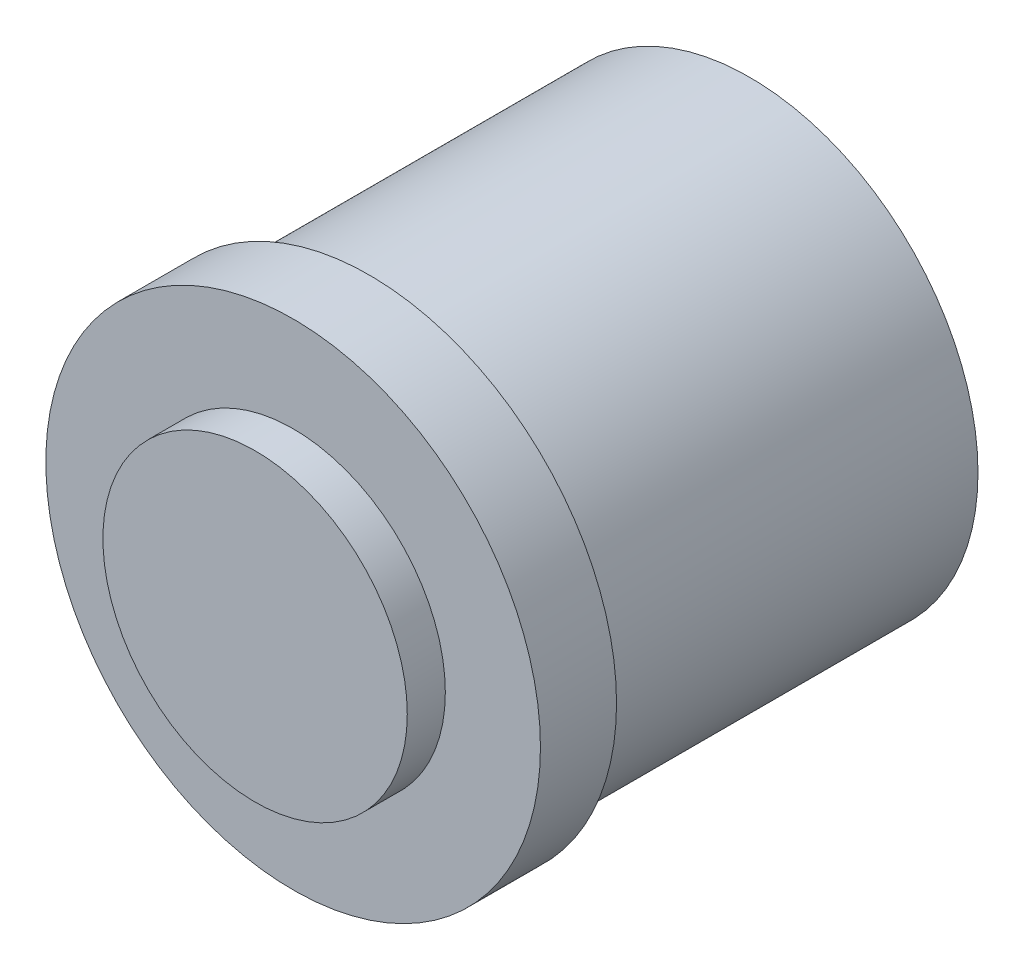
ISO-10303-21;
HEADER;
FILE_DESCRIPTION(('STEP AP214'),'2;1');
FILE_NAME('part.step','',(''),(''),'','','');
FILE_SCHEMA(('AUTOMOTIVE_DESIGN { 1 0 10303 214 1 1 1 1 }'));
ENDSEC;
DATA;
#1=APPLICATION_CONTEXT('core data for automotive mechanical design processes');
#2=APPLICATION_PROTOCOL_DEFINITION('international standard','automotive_design',2000,#1);
#3=PRODUCT_CONTEXT('',#1,'mechanical');
#4=PRODUCT('Part','Part','',(#3));
#5=PRODUCT_RELATED_PRODUCT_CATEGORY('part','',(#4));
#6=PRODUCT_DEFINITION_FORMATION('','',#4);
#7=PRODUCT_DEFINITION_CONTEXT('part definition',#1,'design');
#8=PRODUCT_DEFINITION('design','',#6,#7);
#9=PRODUCT_DEFINITION_SHAPE('','',#8);
#10=(LENGTH_UNIT() NAMED_UNIT(*) SI_UNIT(.MILLI.,.METRE.));
#11=(NAMED_UNIT(*) PLANE_ANGLE_UNIT() SI_UNIT($,.RADIAN.));
#12=(NAMED_UNIT(*) SI_UNIT($,.STERADIAN.) SOLID_ANGLE_UNIT());
#13=UNCERTAINTY_MEASURE_WITH_UNIT(LENGTH_MEASURE(1.E-05),#10,'distance_accuracy_value','');
#14=(GEOMETRIC_REPRESENTATION_CONTEXT(3) GLOBAL_UNCERTAINTY_ASSIGNED_CONTEXT((#13)) GLOBAL_UNIT_ASSIGNED_CONTEXT((#10,
#11,#12)) REPRESENTATION_CONTEXT('',''));
#15=CARTESIAN_POINT('',(0.,0.,0.));
#16=DIRECTION('',(0.,0.,1.));
#17=DIRECTION('',(1.,0.,0.));
#18=AXIS2_PLACEMENT_3D('',#15,#16,#17);
#19=CARTESIAN_POINT('',(0.,0.,76.2));
#20=DIRECTION('',(0.,0.,1.));
#21=DIRECTION('',(1.,0.,0.));
#22=AXIS2_PLACEMENT_3D('',#19,#20,#21);
#23=PLANE('',#22);
#24=CARTESIAN_POINT('',(0.,0.,76.2));
#25=DIRECTION('',(0.,0.,1.));
#26=DIRECTION('',(1.,0.,0.));
#27=AXIS2_PLACEMENT_3D('',#24,#25,#26);
#28=CIRCLE('',#27,41.275);
#29=CARTESIAN_POINT('',(41.275,0.,76.2));
#30=VERTEX_POINT('',#29);
#31=EDGE_CURVE('E49',#30,#30,#28,.T.);
#32=ORIENTED_EDGE('',*,*,#31,.T.);
#33=EDGE_LOOP('',(#32));
#34=FACE_BOUND('',#33,.T.);
#35=CARTESIAN_POINT('',(0.,0.,76.2));
#36=DIRECTION('',(0.,0.,1.));
#37=DIRECTION('',(1.,0.,0.));
#38=AXIS2_PLACEMENT_3D('',#35,#36,#37);
#39=CIRCLE('',#38,25.4);
#40=CARTESIAN_POINT('',(25.4,0.,76.2));
#41=VERTEX_POINT('',#40);
#42=EDGE_CURVE('E59',#41,#41,#39,.T.);
#43=ORIENTED_EDGE('',*,*,#42,.F.);
#44=EDGE_LOOP('',(#43));
#45=FACE_BOUND('',#44,.T.);
#46=ADVANCED_FACE('F36',(#34,#45),#23,.T.);
#47=CARTESIAN_POINT('',(0.,0.,63.5));
#48=DIRECTION('',(0.,0.,-1.));
#49=DIRECTION('',(-1.,0.,0.));
#50=AXIS2_PLACEMENT_3D('',#47,#48,#49);
#51=CYLINDRICAL_SURFACE('',#50,38.1);
#52=CARTESIAN_POINT('',(0.,0.,63.5));
#53=DIRECTION('',(0.,0.,1.));
#54=DIRECTION('',(1.,0.,0.));
#55=AXIS2_PLACEMENT_3D('',#52,#53,#54);
#56=CIRCLE('',#55,38.1);
#57=CARTESIAN_POINT('',(38.1,0.,63.5));
#58=VERTEX_POINT('',#57);
#59=EDGE_CURVE('E10',#58,#58,#56,.T.);
#60=ORIENTED_EDGE('',*,*,#59,.F.);
#61=EDGE_LOOP('',(#60));
#62=FACE_BOUND('',#61,.T.);
#63=CARTESIAN_POINT('',(0.,0.,0.));
#64=DIRECTION('',(0.,0.,1.));
#65=DIRECTION('',(1.,0.,0.));
#66=AXIS2_PLACEMENT_3D('',#63,#64,#65);
#67=CIRCLE('',#66,38.1);
#68=CARTESIAN_POINT('',(38.1,0.,0.));
#69=VERTEX_POINT('',#68);
#70=EDGE_CURVE('E40',#69,#69,#67,.T.);
#71=ORIENTED_EDGE('',*,*,#70,.T.);
#72=EDGE_LOOP('',(#71));
#73=FACE_BOUND('',#72,.T.);
#74=ADVANCED_FACE('F38',(#62,#73),#51,.T.);
#75=CARTESIAN_POINT('',(0.,0.,0.));
#76=DIRECTION('',(0.,0.,1.));
#77=DIRECTION('',(1.,0.,0.));
#78=AXIS2_PLACEMENT_3D('',#75,#76,#77);
#79=PLANE('',#78);
#80=ORIENTED_EDGE('',*,*,#70,.F.);
#81=EDGE_LOOP('',(#80));
#82=FACE_BOUND('',#81,.T.);
#83=ADVANCED_FACE('F82',(#82),#79,.F.);
#84=CARTESIAN_POINT('',(0.,0.,63.5));
#85=DIRECTION('',(0.,0.,1.));
#86=DIRECTION('',(1.,0.,0.));
#87=AXIS2_PLACEMENT_3D('',#84,#85,#86);
#88=PLANE('',#87);
#89=CARTESIAN_POINT('',(0.,0.,63.5));
#90=DIRECTION('',(0.,0.,1.));
#91=DIRECTION('',(1.,0.,0.));
#92=AXIS2_PLACEMENT_3D('',#89,#90,#91);
#93=CIRCLE('',#92,41.275);
#94=CARTESIAN_POINT('',(41.275,0.,63.5));
#95=VERTEX_POINT('',#94);
#96=EDGE_CURVE('E51',#95,#95,#93,.T.);
#97=ORIENTED_EDGE('',*,*,#96,.F.);
#98=EDGE_LOOP('',(#97));
#99=FACE_BOUND('',#98,.T.);
#100=ORIENTED_EDGE('',*,*,#59,.T.);
#101=EDGE_LOOP('',(#100));
#102=FACE_BOUND('',#101,.T.);
#103=ADVANCED_FACE('F86',(#99,#102),#88,.F.);
#104=CARTESIAN_POINT('',(0.,0.,76.2));
#105=DIRECTION('',(0.,0.,-1.));
#106=DIRECTION('',(-1.,0.,0.));
#107=AXIS2_PLACEMENT_3D('',#104,#105,#106);
#108=CYLINDRICAL_SURFACE('',#107,41.275);
#109=ORIENTED_EDGE('',*,*,#31,.F.);
#110=EDGE_LOOP('',(#109));
#111=FACE_BOUND('',#110,.T.);
#112=ORIENTED_EDGE('',*,*,#96,.T.);
#113=EDGE_LOOP('',(#112));
#114=FACE_BOUND('',#113,.T.);
#115=ADVANCED_FACE('F72',(#111,#114),#108,.T.);
#116=CARTESIAN_POINT('',(0.,0.,82.55));
#117=DIRECTION('',(0.,0.,-1.));
#118=DIRECTION('',(-1.,0.,0.));
#119=AXIS2_PLACEMENT_3D('',#116,#117,#118);
#120=CYLINDRICAL_SURFACE('',#119,25.4);
#121=CARTESIAN_POINT('',(0.,0.,82.55));
#122=DIRECTION('',(0.,0.,1.));
#123=DIRECTION('',(1.,0.,0.));
#124=AXIS2_PLACEMENT_3D('',#121,#122,#123);
#125=CIRCLE('',#124,25.4);
#126=CARTESIAN_POINT('',(25.4,0.,82.55));
#127=VERTEX_POINT('',#126);
#128=EDGE_CURVE('E55',#127,#127,#125,.T.);
#129=ORIENTED_EDGE('',*,*,#128,.F.);
#130=EDGE_LOOP('',(#129));
#131=FACE_BOUND('',#130,.T.);
#132=ORIENTED_EDGE('',*,*,#42,.T.);
#133=EDGE_LOOP('',(#132));
#134=FACE_BOUND('',#133,.T.);
#135=ADVANCED_FACE('F69',(#131,#134),#120,.T.);
#136=CARTESIAN_POINT('',(0.,0.,82.55));
#137=DIRECTION('',(0.,0.,1.));
#138=DIRECTION('',(1.,0.,0.));
#139=AXIS2_PLACEMENT_3D('',#136,#137,#138);
#140=PLANE('',#139);
#141=ORIENTED_EDGE('',*,*,#128,.T.);
#142=EDGE_LOOP('',(#141));
#143=FACE_BOUND('',#142,.T.);
#144=ADVANCED_FACE('F67',(#143),#140,.T.);
#145=CLOSED_SHELL('',(#46,#74,#83,#103,#115,#135,#144));
#146=MANIFOLD_SOLID_BREP('B2',#145);
#147=ADVANCED_BREP_SHAPE_REPRESENTATION('',(#18,#146),#14);
#148=SHAPE_DEFINITION_REPRESENTATION(#9,#147);
ENDSEC;
END-ISO-10303-21;
